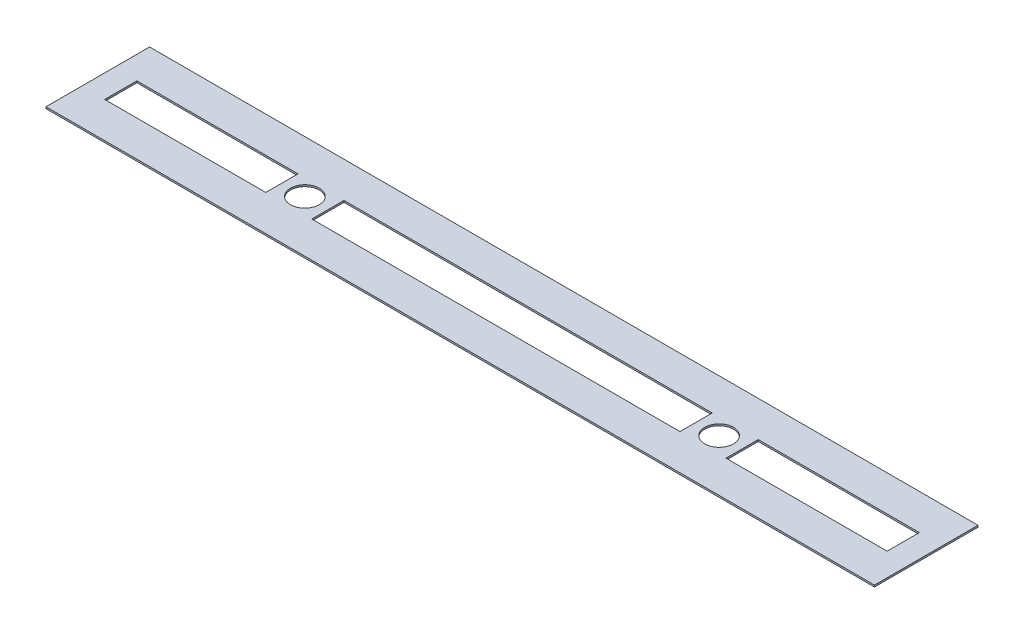
ISO-10303-21;
HEADER;
FILE_DESCRIPTION(('STEP AP214'),'2;1');
FILE_NAME('part.step','',(''),(''),'','','');
FILE_SCHEMA(('AUTOMOTIVE_DESIGN { 1 0 10303 214 1 1 1 1 }'));
ENDSEC;
DATA;
#1=APPLICATION_CONTEXT('core data for automotive mechanical design processes');
#2=APPLICATION_PROTOCOL_DEFINITION('international standard','automotive_design',2000,#1);
#3=PRODUCT_CONTEXT('',#1,'mechanical');
#4=PRODUCT('Part','Part','',(#3));
#5=PRODUCT_RELATED_PRODUCT_CATEGORY('part','',(#4));
#6=PRODUCT_DEFINITION_FORMATION('','',#4);
#7=PRODUCT_DEFINITION_CONTEXT('part definition',#1,'design');
#8=PRODUCT_DEFINITION('design','',#6,#7);
#9=PRODUCT_DEFINITION_SHAPE('','',#8);
#10=(LENGTH_UNIT() NAMED_UNIT(*) SI_UNIT(.MILLI.,.METRE.));
#11=(NAMED_UNIT(*) PLANE_ANGLE_UNIT() SI_UNIT($,.RADIAN.));
#12=(NAMED_UNIT(*) SI_UNIT($,.STERADIAN.) SOLID_ANGLE_UNIT());
#13=UNCERTAINTY_MEASURE_WITH_UNIT(LENGTH_MEASURE(1.E-05),#10,'distance_accuracy_value','');
#14=(GEOMETRIC_REPRESENTATION_CONTEXT(3) GLOBAL_UNCERTAINTY_ASSIGNED_CONTEXT((#13)) GLOBAL_UNIT_ASSIGNED_CONTEXT((#10,
#11,#12)) REPRESENTATION_CONTEXT('',''));
#15=CARTESIAN_POINT('',(0.,0.,0.));
#16=DIRECTION('',(0.,0.,1.));
#17=DIRECTION('',(1.,0.,0.));
#18=AXIS2_PLACEMENT_3D('',#15,#16,#17);
#19=CARTESIAN_POINT('',(0.,0.15,0.));
#20=DIRECTION('',(0.,1.,0.));
#21=DIRECTION('',(0.,0.,1.));
#22=AXIS2_PLACEMENT_3D('',#19,#20,#21);
#23=PLANE('',#22);
#24=CARTESIAN_POINT('',(-18.,0.15,0.));
#25=DIRECTION('',(0.,1.,0.));
#26=DIRECTION('',(0.,0.,1.));
#27=AXIS2_PLACEMENT_3D('',#24,#25,#26);
#28=CIRCLE('',#27,1.25);
#29=CARTESIAN_POINT('',(-18.,0.15,1.25));
#30=VERTEX_POINT('',#29);
#31=EDGE_CURVE('E249',#30,#30,#28,.T.);
#32=ORIENTED_EDGE('',*,*,#31,.F.);
#33=EDGE_LOOP('',(#32));
#34=FACE_BOUND('',#33,.T.);
#35=DIRECTION('',(0.,0.,1.));
#36=VECTOR('',#35,1.);
#37=CARTESIAN_POINT('',(-36.,0.15,-4.5));
#38=LINE('',#37,#36);
#39=CARTESIAN_POINT('',(-36.,0.15,-4.5));
#40=VERTEX_POINT('',#39);
#41=CARTESIAN_POINT('',(-36.,0.15,4.5));
#42=VERTEX_POINT('',#41);
#43=EDGE_CURVE('E255',#40,#42,#38,.T.);
#44=ORIENTED_EDGE('',*,*,#43,.T.);
#45=DIRECTION('',(1.,0.,0.));
#46=VECTOR('',#45,1.);
#47=CARTESIAN_POINT('',(-36.,0.15,4.5));
#48=LINE('',#47,#46);
#49=CARTESIAN_POINT('',(36.,0.15,4.49999999999999));
#50=VERTEX_POINT('',#49);
#51=EDGE_CURVE('E258',#42,#50,#48,.T.);
#52=ORIENTED_EDGE('',*,*,#51,.T.);
#53=DIRECTION('',(0.,0.,-1.));
#54=VECTOR('',#53,1.);
#55=CARTESIAN_POINT('',(36.,0.15,-4.49999999999999));
#56=LINE('',#55,#54);
#57=CARTESIAN_POINT('',(36.,0.15,-4.49999999999999));
#58=VERTEX_POINT('',#57);
#59=EDGE_CURVE('E261',#50,#58,#56,.T.);
#60=ORIENTED_EDGE('',*,*,#59,.T.);
#61=DIRECTION('',(-1.,0.,0.));
#62=VECTOR('',#61,1.);
#63=CARTESIAN_POINT('',(-36.,0.15,-4.5));
#64=LINE('',#63,#62);
#65=EDGE_CURVE('E263',#58,#40,#64,.T.);
#66=ORIENTED_EDGE('',*,*,#65,.T.);
#67=EDGE_LOOP('',(#44,#52,#60,#66));
#68=FACE_BOUND('',#67,.T.);
#69=CARTESIAN_POINT('',(18.,0.15,0.));
#70=DIRECTION('',(0.,1.,0.));
#71=DIRECTION('',(0.,0.,1.));
#72=AXIS2_PLACEMENT_3D('',#69,#70,#71);
#73=CIRCLE('',#72,1.25);
#74=CARTESIAN_POINT('',(18.,0.15,1.24999999999999));
#75=VERTEX_POINT('',#74);
#76=EDGE_CURVE('E243',#75,#75,#73,.T.);
#77=ORIENTED_EDGE('',*,*,#76,.F.);
#78=EDGE_LOOP('',(#77));
#79=FACE_BOUND('',#78,.T.);
#80=DIRECTION('',(1.,0.,0.));
#81=VECTOR('',#80,1.);
#82=CARTESIAN_POINT('',(-16.,0.15,1.4));
#83=LINE('',#82,#81);
#84=CARTESIAN_POINT('',(-16.,0.15,1.4));
#85=VERTEX_POINT('',#84);
#86=CARTESIAN_POINT('',(16.,0.15,1.40000000000001));
#87=VERTEX_POINT('',#86);
#88=EDGE_CURVE('E214',#85,#87,#83,.T.);
#89=ORIENTED_EDGE('',*,*,#88,.F.);
#90=DIRECTION('',(0.,0.,1.));
#91=VECTOR('',#90,1.);
#92=CARTESIAN_POINT('',(-16.,0.15,-1.4));
#93=LINE('',#92,#91);
#94=CARTESIAN_POINT('',(-16.,0.15,-1.4));
#95=VERTEX_POINT('',#94);
#96=EDGE_CURVE('E212',#95,#85,#93,.T.);
#97=ORIENTED_EDGE('',*,*,#96,.F.);
#98=DIRECTION('',(-1.,0.,0.));
#99=VECTOR('',#98,1.);
#100=CARTESIAN_POINT('',(-16.,0.15,-1.4));
#101=LINE('',#100,#99);
#102=CARTESIAN_POINT('',(16.,0.15,-1.40000000000001));
#103=VERTEX_POINT('',#102);
#104=EDGE_CURVE('E220',#103,#95,#101,.T.);
#105=ORIENTED_EDGE('',*,*,#104,.F.);
#106=DIRECTION('',(0.,0.,-1.));
#107=VECTOR('',#106,1.);
#108=CARTESIAN_POINT('',(16.,0.15,-1.40000000000001));
#109=LINE('',#108,#107);
#110=EDGE_CURVE('E217',#87,#103,#109,.T.);
#111=ORIENTED_EDGE('',*,*,#110,.F.);
#112=EDGE_LOOP('',(#89,#97,#105,#111));
#113=FACE_BOUND('',#112,.T.);
#114=DIRECTION('',(0.,0.,1.));
#115=VECTOR('',#114,1.);
#116=CARTESIAN_POINT('',(20.,0.15,-1.4));
#117=LINE('',#116,#115);
#118=CARTESIAN_POINT('',(20.,0.15,-1.4));
#119=VERTEX_POINT('',#118);
#120=CARTESIAN_POINT('',(20.,0.15,1.4));
#121=VERTEX_POINT('',#120);
#122=EDGE_CURVE('E183',#119,#121,#117,.T.);
#123=ORIENTED_EDGE('',*,*,#122,.F.);
#124=DIRECTION('',(-1.,0.,0.));
#125=VECTOR('',#124,1.);
#126=CARTESIAN_POINT('',(34.,0.15,-1.4));
#127=LINE('',#126,#125);
#128=CARTESIAN_POINT('',(34.,0.15,-1.4));
#129=VERTEX_POINT('',#128);
#130=EDGE_CURVE('E181',#129,#119,#127,.T.);
#131=ORIENTED_EDGE('',*,*,#130,.F.);
#132=DIRECTION('',(0.,0.,-1.));
#133=VECTOR('',#132,1.);
#134=CARTESIAN_POINT('',(34.,0.15,-1.4));
#135=LINE('',#134,#133);
#136=CARTESIAN_POINT('',(34.,0.15,1.4));
#137=VERTEX_POINT('',#136);
#138=EDGE_CURVE('E189',#137,#129,#135,.T.);
#139=ORIENTED_EDGE('',*,*,#138,.F.);
#140=DIRECTION('',(1.,0.,0.));
#141=VECTOR('',#140,1.);
#142=CARTESIAN_POINT('',(34.,0.15,1.4));
#143=LINE('',#142,#141);
#144=EDGE_CURVE('E186',#121,#137,#143,.T.);
#145=ORIENTED_EDGE('',*,*,#144,.F.);
#146=EDGE_LOOP('',(#123,#131,#139,#145));
#147=FACE_BOUND('',#146,.T.);
#148=DIRECTION('',(1.,0.,0.));
#149=VECTOR('',#148,1.);
#150=CARTESIAN_POINT('',(-34.,0.15,1.4));
#151=LINE('',#150,#149);
#152=CARTESIAN_POINT('',(-34.,0.15,1.4));
#153=VERTEX_POINT('',#152);
#154=CARTESIAN_POINT('',(-20.,0.15,1.4));
#155=VERTEX_POINT('',#154);
#156=EDGE_CURVE('E153',#153,#155,#151,.T.);
#157=ORIENTED_EDGE('',*,*,#156,.F.);
#158=DIRECTION('',(0.,0.,1.));
#159=VECTOR('',#158,1.);
#160=CARTESIAN_POINT('',(-34.,0.15,-1.4));
#161=LINE('',#160,#159);
#162=CARTESIAN_POINT('',(-34.,0.15,-1.4));
#163=VERTEX_POINT('',#162);
#164=EDGE_CURVE('E145',#163,#153,#161,.T.);
#165=ORIENTED_EDGE('',*,*,#164,.F.);
#166=DIRECTION('',(-1.,0.,0.));
#167=VECTOR('',#166,1.);
#168=CARTESIAN_POINT('',(-34.,0.15,-1.4));
#169=LINE('',#168,#167);
#170=CARTESIAN_POINT('',(-20.,0.15,-1.4));
#171=VERTEX_POINT('',#170);
#172=EDGE_CURVE('E167',#171,#163,#169,.T.);
#173=ORIENTED_EDGE('',*,*,#172,.F.);
#174=DIRECTION('',(0.,0.,-1.));
#175=VECTOR('',#174,1.);
#176=CARTESIAN_POINT('',(-20.,0.15,-1.4));
#177=LINE('',#176,#175);
#178=EDGE_CURVE('E165',#155,#171,#177,.T.);
#179=ORIENTED_EDGE('',*,*,#178,.F.);
#180=EDGE_LOOP('',(#157,#165,#173,#179));
#181=FACE_BOUND('',#180,.T.);
#182=ADVANCED_FACE('F32',(#34,#68,#79,#113,#147,#181),#23,.T.);
#183=CARTESIAN_POINT('',(0.,0.,0.));
#184=DIRECTION('',(0.,1.,0.));
#185=DIRECTION('',(0.,0.,1.));
#186=AXIS2_PLACEMENT_3D('',#183,#184,#185);
#187=PLANE('',#186);
#188=DIRECTION('',(-1.,0.,0.));
#189=VECTOR('',#188,1.);
#190=CARTESIAN_POINT('',(34.,0.,-1.4));
#191=LINE('',#190,#189);
#192=CARTESIAN_POINT('',(34.,0.,-1.4));
#193=VERTEX_POINT('',#192);
#194=CARTESIAN_POINT('',(20.,0.,-1.4));
#195=VERTEX_POINT('',#194);
#196=EDGE_CURVE('E161',#193,#195,#191,.T.);
#197=ORIENTED_EDGE('',*,*,#196,.T.);
#198=DIRECTION('',(0.,0.,1.));
#199=VECTOR('',#198,1.);
#200=CARTESIAN_POINT('',(20.,0.,-1.4));
#201=LINE('',#200,#199);
#202=CARTESIAN_POINT('',(20.,0.,1.4));
#203=VERTEX_POINT('',#202);
#204=EDGE_CURVE('E194',#195,#203,#201,.T.);
#205=ORIENTED_EDGE('',*,*,#204,.T.);
#206=DIRECTION('',(1.,0.,0.));
#207=VECTOR('',#206,1.);
#208=CARTESIAN_POINT('',(34.,0.,1.4));
#209=LINE('',#208,#207);
#210=CARTESIAN_POINT('',(34.,0.,1.4));
#211=VERTEX_POINT('',#210);
#212=EDGE_CURVE('E197',#203,#211,#209,.T.);
#213=ORIENTED_EDGE('',*,*,#212,.T.);
#214=DIRECTION('',(0.,0.,-1.));
#215=VECTOR('',#214,1.);
#216=CARTESIAN_POINT('',(34.,0.,-1.4));
#217=LINE('',#216,#215);
#218=EDGE_CURVE('E184',#211,#193,#217,.T.);
#219=ORIENTED_EDGE('',*,*,#218,.T.);
#220=EDGE_LOOP('',(#197,#205,#213,#219));
#221=FACE_BOUND('',#220,.T.);
#222=CARTESIAN_POINT('',(18.,0.,0.));
#223=DIRECTION('',(0.,1.,0.));
#224=DIRECTION('',(0.,0.,1.));
#225=AXIS2_PLACEMENT_3D('',#222,#223,#224);
#226=CIRCLE('',#225,1.25);
#227=CARTESIAN_POINT('',(18.,0.,1.24999999999999));
#228=VERTEX_POINT('',#227);
#229=EDGE_CURVE('E242',#228,#228,#226,.T.);
#230=ORIENTED_EDGE('',*,*,#229,.T.);
#231=EDGE_LOOP('',(#230));
#232=FACE_BOUND('',#231,.T.);
#233=CARTESIAN_POINT('',(-18.,0.,0.));
#234=DIRECTION('',(0.,1.,0.));
#235=DIRECTION('',(0.,0.,1.));
#236=AXIS2_PLACEMENT_3D('',#233,#234,#235);
#237=CIRCLE('',#236,1.25);
#238=CARTESIAN_POINT('',(-18.,0.,1.25));
#239=VERTEX_POINT('',#238);
#240=EDGE_CURVE('E246',#239,#239,#237,.T.);
#241=ORIENTED_EDGE('',*,*,#240,.T.);
#242=EDGE_LOOP('',(#241));
#243=FACE_BOUND('',#242,.T.);
#244=DIRECTION('',(0.,0.,1.));
#245=VECTOR('',#244,1.);
#246=CARTESIAN_POINT('',(-36.,0.,-4.5));
#247=LINE('',#246,#245);
#248=CARTESIAN_POINT('',(-36.,0.,-4.5));
#249=VERTEX_POINT('',#248);
#250=CARTESIAN_POINT('',(-36.,0.,4.5));
#251=VERTEX_POINT('',#250);
#252=EDGE_CURVE('E252',#249,#251,#247,.T.);
#253=ORIENTED_EDGE('',*,*,#252,.F.);
#254=DIRECTION('',(-1.,0.,0.));
#255=VECTOR('',#254,1.);
#256=CARTESIAN_POINT('',(-36.,0.,-4.5));
#257=LINE('',#256,#255);
#258=CARTESIAN_POINT('',(36.,0.,-4.49999999999999));
#259=VERTEX_POINT('',#258);
#260=EDGE_CURVE('E259',#259,#249,#257,.T.);
#261=ORIENTED_EDGE('',*,*,#260,.F.);
#262=DIRECTION('',(0.,0.,-1.));
#263=VECTOR('',#262,1.);
#264=CARTESIAN_POINT('',(36.,0.,-4.49999999999999));
#265=LINE('',#264,#263);
#266=CARTESIAN_POINT('',(36.,0.,4.49999999999999));
#267=VERTEX_POINT('',#266);
#268=EDGE_CURVE('E270',#267,#259,#265,.T.);
#269=ORIENTED_EDGE('',*,*,#268,.F.);
#270=DIRECTION('',(1.,0.,0.));
#271=VECTOR('',#270,1.);
#272=CARTESIAN_POINT('',(-36.,0.,4.5));
#273=LINE('',#272,#271);
#274=EDGE_CURVE('E268',#251,#267,#273,.T.);
#275=ORIENTED_EDGE('',*,*,#274,.F.);
#276=EDGE_LOOP('',(#253,#261,#269,#275));
#277=FACE_BOUND('',#276,.T.);
#278=DIRECTION('',(0.,0.,1.));
#279=VECTOR('',#278,1.);
#280=CARTESIAN_POINT('',(-16.,0.,-1.4));
#281=LINE('',#280,#279);
#282=CARTESIAN_POINT('',(-16.,0.,-1.4));
#283=VERTEX_POINT('',#282);
#284=CARTESIAN_POINT('',(-16.,0.,1.4));
#285=VERTEX_POINT('',#284);
#286=EDGE_CURVE('E211',#283,#285,#281,.T.);
#287=ORIENTED_EDGE('',*,*,#286,.T.);
#288=DIRECTION('',(1.,0.,0.));
#289=VECTOR('',#288,1.);
#290=CARTESIAN_POINT('',(-16.,0.,1.4));
#291=LINE('',#290,#289);
#292=CARTESIAN_POINT('',(16.,0.,1.40000000000001));
#293=VERTEX_POINT('',#292);
#294=EDGE_CURVE('E225',#285,#293,#291,.T.);
#295=ORIENTED_EDGE('',*,*,#294,.T.);
#296=DIRECTION('',(0.,0.,-1.));
#297=VECTOR('',#296,1.);
#298=CARTESIAN_POINT('',(16.,0.,-1.40000000000001));
#299=LINE('',#298,#297);
#300=CARTESIAN_POINT('',(16.,0.,-1.40000000000001));
#301=VERTEX_POINT('',#300);
#302=EDGE_CURVE('E228',#293,#301,#299,.T.);
#303=ORIENTED_EDGE('',*,*,#302,.T.);
#304=DIRECTION('',(-1.,0.,0.));
#305=VECTOR('',#304,1.);
#306=CARTESIAN_POINT('',(-16.,0.,-1.4));
#307=LINE('',#306,#305);
#308=EDGE_CURVE('E215',#301,#283,#307,.T.);
#309=ORIENTED_EDGE('',*,*,#308,.T.);
#310=EDGE_LOOP('',(#287,#295,#303,#309));
#311=FACE_BOUND('',#310,.T.);
#312=DIRECTION('',(0.,0.,1.));
#313=VECTOR('',#312,1.);
#314=CARTESIAN_POINT('',(-34.,0.,-1.4));
#315=LINE('',#314,#313);
#316=CARTESIAN_POINT('',(-34.,0.,-1.4));
#317=VERTEX_POINT('',#316);
#318=CARTESIAN_POINT('',(-34.,0.,1.4));
#319=VERTEX_POINT('',#318);
#320=EDGE_CURVE('E55',#317,#319,#315,.T.);
#321=ORIENTED_EDGE('',*,*,#320,.T.);
#322=DIRECTION('',(1.,0.,0.));
#323=VECTOR('',#322,1.);
#324=CARTESIAN_POINT('',(-34.,0.,1.4));
#325=LINE('',#324,#323);
#326=CARTESIAN_POINT('',(-20.,0.,1.4));
#327=VERTEX_POINT('',#326);
#328=EDGE_CURVE('E160',#319,#327,#325,.T.);
#329=ORIENTED_EDGE('',*,*,#328,.T.);
#330=DIRECTION('',(0.,0.,-1.));
#331=VECTOR('',#330,1.);
#332=CARTESIAN_POINT('',(-20.,0.,-1.4));
#333=LINE('',#332,#331);
#334=CARTESIAN_POINT('',(-20.,0.,-1.4));
#335=VERTEX_POINT('',#334);
#336=EDGE_CURVE('E173',#327,#335,#333,.T.);
#337=ORIENTED_EDGE('',*,*,#336,.T.);
#338=DIRECTION('',(-1.,0.,0.));
#339=VECTOR('',#338,1.);
#340=CARTESIAN_POINT('',(-34.,0.,-1.4));
#341=LINE('',#340,#339);
#342=EDGE_CURVE('E154',#335,#317,#341,.T.);
#343=ORIENTED_EDGE('',*,*,#342,.T.);
#344=EDGE_LOOP('',(#321,#329,#337,#343));
#345=FACE_BOUND('',#344,.T.);
#346=ADVANCED_FACE('F288',(#221,#232,#243,#277,#311,#345),#187,.F.);
#347=CARTESIAN_POINT('',(-36.,0.15,-4.5));
#348=DIRECTION('',(1.,0.,0.));
#349=DIRECTION('',(0.,0.,-1.));
#350=AXIS2_PLACEMENT_3D('',#347,#348,#349);
#351=PLANE('',#350);
#352=ORIENTED_EDGE('',*,*,#252,.T.);
#353=DIRECTION('',(0.,-1.,0.));
#354=VECTOR('',#353,1.);
#355=CARTESIAN_POINT('',(-36.,0.15,4.5));
#356=LINE('',#355,#354);
#357=EDGE_CURVE('E11',#42,#251,#356,.T.);
#358=ORIENTED_EDGE('',*,*,#357,.F.);
#359=ORIENTED_EDGE('',*,*,#43,.F.);
#360=DIRECTION('',(0.,-1.,0.));
#361=VECTOR('',#360,1.);
#362=CARTESIAN_POINT('',(-36.,0.15,-4.5));
#363=LINE('',#362,#361);
#364=EDGE_CURVE('E265',#40,#249,#363,.T.);
#365=ORIENTED_EDGE('',*,*,#364,.T.);
#366=EDGE_LOOP('',(#352,#358,#359,#365));
#367=FACE_BOUND('',#366,.T.);
#368=ADVANCED_FACE('F34',(#367),#351,.F.);
#369=CARTESIAN_POINT('',(-36.,0.15,4.5));
#370=DIRECTION('',(0.,0.,-1.));
#371=DIRECTION('',(-1.,0.,0.));
#372=AXIS2_PLACEMENT_3D('',#369,#370,#371);
#373=PLANE('',#372);
#374=ORIENTED_EDGE('',*,*,#274,.T.);
#375=DIRECTION('',(0.,-1.,0.));
#376=VECTOR('',#375,1.);
#377=CARTESIAN_POINT('',(36.,0.15,4.49999999999999));
#378=LINE('',#377,#376);
#379=EDGE_CURVE('E40',#50,#267,#378,.T.);
#380=ORIENTED_EDGE('',*,*,#379,.F.);
#381=ORIENTED_EDGE('',*,*,#51,.F.);
#382=ORIENTED_EDGE('',*,*,#357,.T.);
#383=EDGE_LOOP('',(#374,#380,#381,#382));
#384=FACE_BOUND('',#383,.T.);
#385=ADVANCED_FACE('F299',(#384),#373,.F.);
#386=CARTESIAN_POINT('',(36.,0.15,-4.49999999999999));
#387=DIRECTION('',(-1.,0.,0.));
#388=DIRECTION('',(0.,0.,1.));
#389=AXIS2_PLACEMENT_3D('',#386,#387,#388);
#390=PLANE('',#389);
#391=ORIENTED_EDGE('',*,*,#268,.T.);
#392=DIRECTION('',(0.,-1.,0.));
#393=VECTOR('',#392,1.);
#394=CARTESIAN_POINT('',(36.,0.15,-4.49999999999999));
#395=LINE('',#394,#393);
#396=EDGE_CURVE('E275',#58,#259,#395,.T.);
#397=ORIENTED_EDGE('',*,*,#396,.F.);
#398=ORIENTED_EDGE('',*,*,#59,.F.);
#399=ORIENTED_EDGE('',*,*,#379,.T.);
#400=EDGE_LOOP('',(#391,#397,#398,#399));
#401=FACE_BOUND('',#400,.T.);
#402=ADVANCED_FACE('F282',(#401),#390,.F.);
#403=CARTESIAN_POINT('',(-36.,0.15,-4.5));
#404=DIRECTION('',(0.,0.,1.));
#405=DIRECTION('',(1.,0.,0.));
#406=AXIS2_PLACEMENT_3D('',#403,#404,#405);
#407=PLANE('',#406);
#408=ORIENTED_EDGE('',*,*,#260,.T.);
#409=ORIENTED_EDGE('',*,*,#364,.F.);
#410=ORIENTED_EDGE('',*,*,#65,.F.);
#411=ORIENTED_EDGE('',*,*,#396,.T.);
#412=EDGE_LOOP('',(#408,#409,#410,#411));
#413=FACE_BOUND('',#412,.T.);
#414=ADVANCED_FACE('F292',(#413),#407,.F.);
#415=CARTESIAN_POINT('',(-18.,0.15,0.));
#416=DIRECTION('',(0.,-1.,0.));
#417=DIRECTION('',(0.,0.,-1.));
#418=AXIS2_PLACEMENT_3D('',#415,#416,#417);
#419=CYLINDRICAL_SURFACE('',#418,1.25);
#420=ORIENTED_EDGE('',*,*,#31,.T.);
#421=EDGE_LOOP('',(#420));
#422=FACE_BOUND('',#421,.T.);
#423=ORIENTED_EDGE('',*,*,#240,.F.);
#424=EDGE_LOOP('',(#423));
#425=FACE_BOUND('',#424,.T.);
#426=ADVANCED_FACE('F316',(#422,#425),#419,.F.);
#427=CARTESIAN_POINT('',(18.,0.15,0.));
#428=DIRECTION('',(0.,-1.,0.));
#429=DIRECTION('',(0.,0.,-1.));
#430=AXIS2_PLACEMENT_3D('',#427,#428,#429);
#431=CYLINDRICAL_SURFACE('',#430,1.25);
#432=ORIENTED_EDGE('',*,*,#76,.T.);
#433=EDGE_LOOP('',(#432));
#434=FACE_BOUND('',#433,.T.);
#435=ORIENTED_EDGE('',*,*,#229,.F.);
#436=EDGE_LOOP('',(#435));
#437=FACE_BOUND('',#436,.T.);
#438=ADVANCED_FACE('F323',(#434,#437),#431,.F.);
#439=CARTESIAN_POINT('',(-16.,0.15,-1.4));
#440=DIRECTION('',(1.,0.,0.));
#441=DIRECTION('',(0.,0.,-1.));
#442=AXIS2_PLACEMENT_3D('',#439,#440,#441);
#443=PLANE('',#442);
#444=ORIENTED_EDGE('',*,*,#286,.F.);
#445=DIRECTION('',(0.,-1.,0.));
#446=VECTOR('',#445,1.);
#447=CARTESIAN_POINT('',(-16.,0.15,-1.4));
#448=LINE('',#447,#446);
#449=EDGE_CURVE('E222',#95,#283,#448,.T.);
#450=ORIENTED_EDGE('',*,*,#449,.F.);
#451=ORIENTED_EDGE('',*,*,#96,.T.);
#452=DIRECTION('',(0.,-1.,0.));
#453=VECTOR('',#452,1.);
#454=CARTESIAN_POINT('',(-16.,0.15,1.4));
#455=LINE('',#454,#453);
#456=EDGE_CURVE('E239',#85,#285,#455,.T.);
#457=ORIENTED_EDGE('',*,*,#456,.T.);
#458=EDGE_LOOP('',(#444,#450,#451,#457));
#459=FACE_BOUND('',#458,.T.);
#460=ADVANCED_FACE('F328',(#459),#443,.T.);
#461=CARTESIAN_POINT('',(-16.,0.15,1.4));
#462=DIRECTION('',(0.,0.,-1.));
#463=DIRECTION('',(-1.,0.,0.));
#464=AXIS2_PLACEMENT_3D('',#461,#462,#463);
#465=PLANE('',#464);
#466=ORIENTED_EDGE('',*,*,#294,.F.);
#467=ORIENTED_EDGE('',*,*,#456,.F.);
#468=ORIENTED_EDGE('',*,*,#88,.T.);
#469=DIRECTION('',(0.,-1.,0.));
#470=VECTOR('',#469,1.);
#471=CARTESIAN_POINT('',(16.,0.15,1.40000000000001));
#472=LINE('',#471,#470);
#473=EDGE_CURVE('E237',#87,#293,#472,.T.);
#474=ORIENTED_EDGE('',*,*,#473,.T.);
#475=EDGE_LOOP('',(#466,#467,#468,#474));
#476=FACE_BOUND('',#475,.T.);
#477=ADVANCED_FACE('F336',(#476),#465,.T.);
#478=CARTESIAN_POINT('',(16.,0.15,-1.40000000000001));
#479=DIRECTION('',(-1.,0.,0.));
#480=DIRECTION('',(0.,0.,1.));
#481=AXIS2_PLACEMENT_3D('',#478,#479,#480);
#482=PLANE('',#481);
#483=ORIENTED_EDGE('',*,*,#302,.F.);
#484=ORIENTED_EDGE('',*,*,#473,.F.);
#485=ORIENTED_EDGE('',*,*,#110,.T.);
#486=DIRECTION('',(0.,-1.,0.));
#487=VECTOR('',#486,1.);
#488=CARTESIAN_POINT('',(16.,0.15,-1.40000000000001));
#489=LINE('',#488,#487);
#490=EDGE_CURVE('E235',#103,#301,#489,.T.);
#491=ORIENTED_EDGE('',*,*,#490,.T.);
#492=EDGE_LOOP('',(#483,#484,#485,#491));
#493=FACE_BOUND('',#492,.T.);
#494=ADVANCED_FACE('F343',(#493),#482,.T.);
#495=CARTESIAN_POINT('',(-16.,0.15,-1.4));
#496=DIRECTION('',(0.,0.,1.));
#497=DIRECTION('',(1.,0.,0.));
#498=AXIS2_PLACEMENT_3D('',#495,#496,#497);
#499=PLANE('',#498);
#500=ORIENTED_EDGE('',*,*,#308,.F.);
#501=ORIENTED_EDGE('',*,*,#490,.F.);
#502=ORIENTED_EDGE('',*,*,#104,.T.);
#503=ORIENTED_EDGE('',*,*,#449,.T.);
#504=EDGE_LOOP('',(#500,#501,#502,#503));
#505=FACE_BOUND('',#504,.T.);
#506=ADVANCED_FACE('F347',(#505),#499,.T.);
#507=CARTESIAN_POINT('',(34.,0.15,-1.4));
#508=DIRECTION('',(0.,0.,1.));
#509=DIRECTION('',(1.,0.,0.));
#510=AXIS2_PLACEMENT_3D('',#507,#508,#509);
#511=PLANE('',#510);
#512=ORIENTED_EDGE('',*,*,#196,.F.);
#513=DIRECTION('',(0.,-1.,0.));
#514=VECTOR('',#513,1.);
#515=CARTESIAN_POINT('',(34.,0.15,-1.4));
#516=LINE('',#515,#514);
#517=EDGE_CURVE('E191',#129,#193,#516,.T.);
#518=ORIENTED_EDGE('',*,*,#517,.F.);
#519=ORIENTED_EDGE('',*,*,#130,.T.);
#520=DIRECTION('',(0.,-1.,0.));
#521=VECTOR('',#520,1.);
#522=CARTESIAN_POINT('',(20.,0.15,-1.4));
#523=LINE('',#522,#521);
#524=EDGE_CURVE('E208',#119,#195,#523,.T.);
#525=ORIENTED_EDGE('',*,*,#524,.T.);
#526=EDGE_LOOP('',(#512,#518,#519,#525));
#527=FACE_BOUND('',#526,.T.);
#528=ADVANCED_FACE('F351',(#527),#511,.T.);
#529=CARTESIAN_POINT('',(20.,0.15,-1.4));
#530=DIRECTION('',(1.,0.,0.));
#531=DIRECTION('',(0.,0.,-1.));
#532=AXIS2_PLACEMENT_3D('',#529,#530,#531);
#533=PLANE('',#532);
#534=ORIENTED_EDGE('',*,*,#204,.F.);
#535=ORIENTED_EDGE('',*,*,#524,.F.);
#536=ORIENTED_EDGE('',*,*,#122,.T.);
#537=DIRECTION('',(0.,-1.,0.));
#538=VECTOR('',#537,1.);
#539=CARTESIAN_POINT('',(20.,0.15,1.4));
#540=LINE('',#539,#538);
#541=EDGE_CURVE('E206',#121,#203,#540,.T.);
#542=ORIENTED_EDGE('',*,*,#541,.T.);
#543=EDGE_LOOP('',(#534,#535,#536,#542));
#544=FACE_BOUND('',#543,.T.);
#545=ADVANCED_FACE('F355',(#544),#533,.T.);
#546=CARTESIAN_POINT('',(34.,0.15,1.4));
#547=DIRECTION('',(0.,0.,-1.));
#548=DIRECTION('',(-1.,0.,0.));
#549=AXIS2_PLACEMENT_3D('',#546,#547,#548);
#550=PLANE('',#549);
#551=ORIENTED_EDGE('',*,*,#212,.F.);
#552=ORIENTED_EDGE('',*,*,#541,.F.);
#553=ORIENTED_EDGE('',*,*,#144,.T.);
#554=DIRECTION('',(0.,-1.,0.));
#555=VECTOR('',#554,1.);
#556=CARTESIAN_POINT('',(34.,0.15,1.4));
#557=LINE('',#556,#555);
#558=EDGE_CURVE('E204',#137,#211,#557,.T.);
#559=ORIENTED_EDGE('',*,*,#558,.T.);
#560=EDGE_LOOP('',(#551,#552,#553,#559));
#561=FACE_BOUND('',#560,.T.);
#562=ADVANCED_FACE('F359',(#561),#550,.T.);
#563=CARTESIAN_POINT('',(34.,0.15,-1.4));
#564=DIRECTION('',(-1.,0.,0.));
#565=DIRECTION('',(0.,0.,1.));
#566=AXIS2_PLACEMENT_3D('',#563,#564,#565);
#567=PLANE('',#566);
#568=ORIENTED_EDGE('',*,*,#218,.F.);
#569=ORIENTED_EDGE('',*,*,#558,.F.);
#570=ORIENTED_EDGE('',*,*,#138,.T.);
#571=ORIENTED_EDGE('',*,*,#517,.T.);
#572=EDGE_LOOP('',(#568,#569,#570,#571));
#573=FACE_BOUND('',#572,.T.);
#574=ADVANCED_FACE('F363',(#573),#567,.T.);
#575=CARTESIAN_POINT('',(-34.,0.15,-1.4));
#576=DIRECTION('',(1.,0.,0.));
#577=DIRECTION('',(0.,0.,-1.));
#578=AXIS2_PLACEMENT_3D('',#575,#576,#577);
#579=PLANE('',#578);
#580=ORIENTED_EDGE('',*,*,#320,.F.);
#581=DIRECTION('',(0.,-1.,0.));
#582=VECTOR('',#581,1.);
#583=CARTESIAN_POINT('',(-34.,0.15,-1.4));
#584=LINE('',#583,#582);
#585=EDGE_CURVE('E149',#163,#317,#584,.T.);
#586=ORIENTED_EDGE('',*,*,#585,.F.);
#587=ORIENTED_EDGE('',*,*,#164,.T.);
#588=DIRECTION('',(0.,-1.,0.));
#589=VECTOR('',#588,1.);
#590=CARTESIAN_POINT('',(-34.,0.15,1.4));
#591=LINE('',#590,#589);
#592=EDGE_CURVE('E148',#153,#319,#591,.T.);
#593=ORIENTED_EDGE('',*,*,#592,.T.);
#594=EDGE_LOOP('',(#580,#586,#587,#593));
#595=FACE_BOUND('',#594,.T.);
#596=ADVANCED_FACE('F147',(#595),#579,.T.);
#597=CARTESIAN_POINT('',(-34.,0.15,1.4));
#598=DIRECTION('',(0.,0.,-1.));
#599=DIRECTION('',(-1.,0.,0.));
#600=AXIS2_PLACEMENT_3D('',#597,#598,#599);
#601=PLANE('',#600);
#602=ORIENTED_EDGE('',*,*,#328,.F.);
#603=ORIENTED_EDGE('',*,*,#592,.F.);
#604=ORIENTED_EDGE('',*,*,#156,.T.);
#605=DIRECTION('',(0.,-1.,0.));
#606=VECTOR('',#605,1.);
#607=CARTESIAN_POINT('',(-20.,0.15,1.4));
#608=LINE('',#607,#606);
#609=EDGE_CURVE('E162',#155,#327,#608,.T.);
#610=ORIENTED_EDGE('',*,*,#609,.T.);
#611=EDGE_LOOP('',(#602,#603,#604,#610));
#612=FACE_BOUND('',#611,.T.);
#613=ADVANCED_FACE('F157',(#612),#601,.T.);
#614=CARTESIAN_POINT('',(-20.,0.15,-1.4));
#615=DIRECTION('',(-1.,0.,0.));
#616=DIRECTION('',(0.,0.,1.));
#617=AXIS2_PLACEMENT_3D('',#614,#615,#616);
#618=PLANE('',#617);
#619=ORIENTED_EDGE('',*,*,#336,.F.);
#620=ORIENTED_EDGE('',*,*,#609,.F.);
#621=ORIENTED_EDGE('',*,*,#178,.T.);
#622=DIRECTION('',(0.,-1.,0.));
#623=VECTOR('',#622,1.);
#624=CARTESIAN_POINT('',(-20.,0.15,-1.4));
#625=LINE('',#624,#623);
#626=EDGE_CURVE('E47',#171,#335,#625,.T.);
#627=ORIENTED_EDGE('',*,*,#626,.T.);
#628=EDGE_LOOP('',(#619,#620,#621,#627));
#629=FACE_BOUND('',#628,.T.);
#630=ADVANCED_FACE('F372',(#629),#618,.T.);
#631=CARTESIAN_POINT('',(-34.,0.15,-1.4));
#632=DIRECTION('',(0.,0.,1.));
#633=DIRECTION('',(1.,0.,0.));
#634=AXIS2_PLACEMENT_3D('',#631,#632,#633);
#635=PLANE('',#634);
#636=ORIENTED_EDGE('',*,*,#342,.F.);
#637=ORIENTED_EDGE('',*,*,#626,.F.);
#638=ORIENTED_EDGE('',*,*,#172,.T.);
#639=ORIENTED_EDGE('',*,*,#585,.T.);
#640=EDGE_LOOP('',(#636,#637,#638,#639));
#641=FACE_BOUND('',#640,.T.);
#642=ADVANCED_FACE('F375',(#641),#635,.T.);
#643=CLOSED_SHELL('',(#182,#346,#368,#385,#402,#414,#426,#438,#460,#477,#494,#506,#528,#545,
#562,#574,#596,#613,#630,#642));
#644=MANIFOLD_SOLID_BREP('B2',#643);
#645=ADVANCED_BREP_SHAPE_REPRESENTATION('',(#18,#644),#14);
#646=SHAPE_DEFINITION_REPRESENTATION(#9,#645);
ENDSEC;
END-ISO-10303-21;
